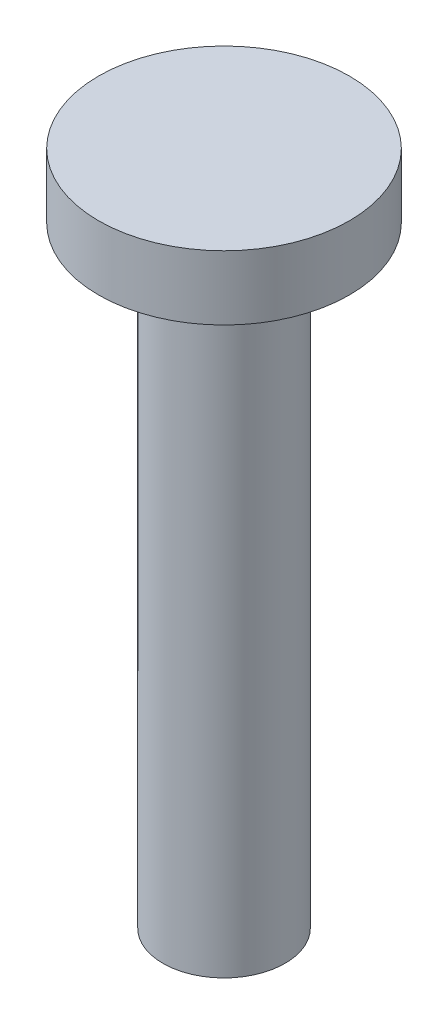
ISO-10303-21;
HEADER;
FILE_DESCRIPTION(('STEP AP214'),'2;1');
FILE_NAME('part.step','',(''),(''),'','','');
FILE_SCHEMA(('AUTOMOTIVE_DESIGN { 1 0 10303 214 1 1 1 1 }'));
ENDSEC;
DATA;
#1=APPLICATION_CONTEXT('core data for automotive mechanical design processes');
#2=APPLICATION_PROTOCOL_DEFINITION('international standard','automotive_design',2000,#1);
#3=PRODUCT_CONTEXT('',#1,'mechanical');
#4=PRODUCT('Part','Part','',(#3));
#5=PRODUCT_RELATED_PRODUCT_CATEGORY('part','',(#4));
#6=PRODUCT_DEFINITION_FORMATION('','',#4);
#7=PRODUCT_DEFINITION_CONTEXT('part definition',#1,'design');
#8=PRODUCT_DEFINITION('design','',#6,#7);
#9=PRODUCT_DEFINITION_SHAPE('','',#8);
#10=(LENGTH_UNIT() NAMED_UNIT(*) SI_UNIT(.MILLI.,.METRE.));
#11=(NAMED_UNIT(*) PLANE_ANGLE_UNIT() SI_UNIT($,.RADIAN.));
#12=(NAMED_UNIT(*) SI_UNIT($,.STERADIAN.) SOLID_ANGLE_UNIT());
#13=UNCERTAINTY_MEASURE_WITH_UNIT(LENGTH_MEASURE(1.E-05),#10,'distance_accuracy_value','');
#14=(GEOMETRIC_REPRESENTATION_CONTEXT(3) GLOBAL_UNCERTAINTY_ASSIGNED_CONTEXT((#13)) GLOBAL_UNIT_ASSIGNED_CONTEXT((#10,
#11,#12)) REPRESENTATION_CONTEXT('',''));
#15=CARTESIAN_POINT('',(0.,0.,0.));
#16=DIRECTION('',(0.,0.,1.));
#17=DIRECTION('',(1.,0.,0.));
#18=AXIS2_PLACEMENT_3D('',#15,#16,#17);
#19=CARTESIAN_POINT('',(1.9,0.,0.));
#20=DIRECTION('',(0.,-1.,0.));
#21=DIRECTION('',(1.,0.,0.));
#22=AXIS2_PLACEMENT_3D('',#19,#20,#21);
#23=PLANE('',#22);
#24=CARTESIAN_POINT('',(1.9,0.,0.));
#25=DIRECTION('',(0.,1.,0.));
#26=DIRECTION('',(-1.,0.,0.));
#27=AXIS2_PLACEMENT_3D('',#24,#25,#26);
#28=CIRCLE('',#27,1.9);
#29=CARTESIAN_POINT('',(0.,0.,0.));
#30=VERTEX_POINT('',#29);
#31=EDGE_CURVE('E10',#30,#30,#28,.T.);
#32=ORIENTED_EDGE('',*,*,#31,.F.);
#33=EDGE_LOOP('',(#32));
#34=FACE_BOUND('',#33,.T.);
#35=ADVANCED_FACE('F37',(#34),#23,.T.);
#36=CARTESIAN_POINT('',(1.9,21.,0.));
#37=DIRECTION('',(0.,1.,0.));
#38=DIRECTION('',(-1.,0.,0.));
#39=AXIS2_PLACEMENT_3D('',#36,#37,#38);
#40=CYLINDRICAL_SURFACE('',#39,1.9);
#41=ORIENTED_EDGE('',*,*,#31,.T.);
#42=EDGE_LOOP('',(#41));
#43=FACE_BOUND('',#42,.T.);
#44=CARTESIAN_POINT('',(1.9,19.,0.));
#45=DIRECTION('',(0.,1.,0.));
#46=DIRECTION('',(-1.,0.,0.));
#47=AXIS2_PLACEMENT_3D('',#44,#45,#46);
#48=CIRCLE('',#47,1.9);
#49=CARTESIAN_POINT('',(0.,19.,0.));
#50=VERTEX_POINT('',#49);
#51=EDGE_CURVE('E43',#50,#50,#48,.T.);
#52=ORIENTED_EDGE('',*,*,#51,.F.);
#53=EDGE_LOOP('',(#52));
#54=FACE_BOUND('',#53,.T.);
#55=ADVANCED_FACE('F69',(#43,#54),#40,.T.);
#56=CARTESIAN_POINT('',(0.,19.,0.));
#57=DIRECTION('',(0.,-1.,0.));
#58=DIRECTION('',(1.,0.,0.));
#59=AXIS2_PLACEMENT_3D('',#56,#57,#58);
#60=PLANE('',#59);
#61=ORIENTED_EDGE('',*,*,#51,.T.);
#62=EDGE_LOOP('',(#61));
#63=FACE_BOUND('',#62,.T.);
#64=CARTESIAN_POINT('',(1.9,19.,0.));
#65=DIRECTION('',(0.,1.,0.));
#66=DIRECTION('',(-1.,0.,0.));
#67=AXIS2_PLACEMENT_3D('',#64,#65,#66);
#68=CIRCLE('',#67,3.9);
#69=CARTESIAN_POINT('',(-2.,19.,0.));
#70=VERTEX_POINT('',#69);
#71=EDGE_CURVE('E47',#70,#70,#68,.T.);
#72=ORIENTED_EDGE('',*,*,#71,.F.);
#73=EDGE_LOOP('',(#72));
#74=FACE_BOUND('',#73,.T.);
#75=ADVANCED_FACE('F61',(#63,#74),#60,.T.);
#76=CARTESIAN_POINT('',(1.9,21.,0.));
#77=DIRECTION('',(0.,1.,0.));
#78=DIRECTION('',(-1.,0.,0.));
#79=AXIS2_PLACEMENT_3D('',#76,#77,#78);
#80=CYLINDRICAL_SURFACE('',#79,3.9);
#81=ORIENTED_EDGE('',*,*,#71,.T.);
#82=EDGE_LOOP('',(#81));
#83=FACE_BOUND('',#82,.T.);
#84=CARTESIAN_POINT('',(1.9,21.,0.));
#85=DIRECTION('',(0.,1.,0.));
#86=DIRECTION('',(-1.,0.,0.));
#87=AXIS2_PLACEMENT_3D('',#84,#85,#86);
#88=CIRCLE('',#87,3.9);
#89=CARTESIAN_POINT('',(-2.,21.,0.));
#90=VERTEX_POINT('',#89);
#91=EDGE_CURVE('E51',#90,#90,#88,.T.);
#92=ORIENTED_EDGE('',*,*,#91,.F.);
#93=EDGE_LOOP('',(#92));
#94=FACE_BOUND('',#93,.T.);
#95=ADVANCED_FACE('F59',(#83,#94),#80,.T.);
#96=CARTESIAN_POINT('',(-2.,21.,0.));
#97=DIRECTION('',(0.,1.,0.));
#98=DIRECTION('',(-1.,0.,0.));
#99=AXIS2_PLACEMENT_3D('',#96,#97,#98);
#100=PLANE('',#99);
#101=ORIENTED_EDGE('',*,*,#91,.T.);
#102=EDGE_LOOP('',(#101));
#103=FACE_BOUND('',#102,.T.);
#104=ADVANCED_FACE('F57',(#103),#100,.T.);
#105=CLOSED_SHELL('',(#35,#55,#75,#95,#104));
#106=MANIFOLD_SOLID_BREP('B2',#105);
#107=ADVANCED_BREP_SHAPE_REPRESENTATION('',(#18,#106),#14);
#108=SHAPE_DEFINITION_REPRESENTATION(#9,#107);
ENDSEC;
END-ISO-10303-21;
